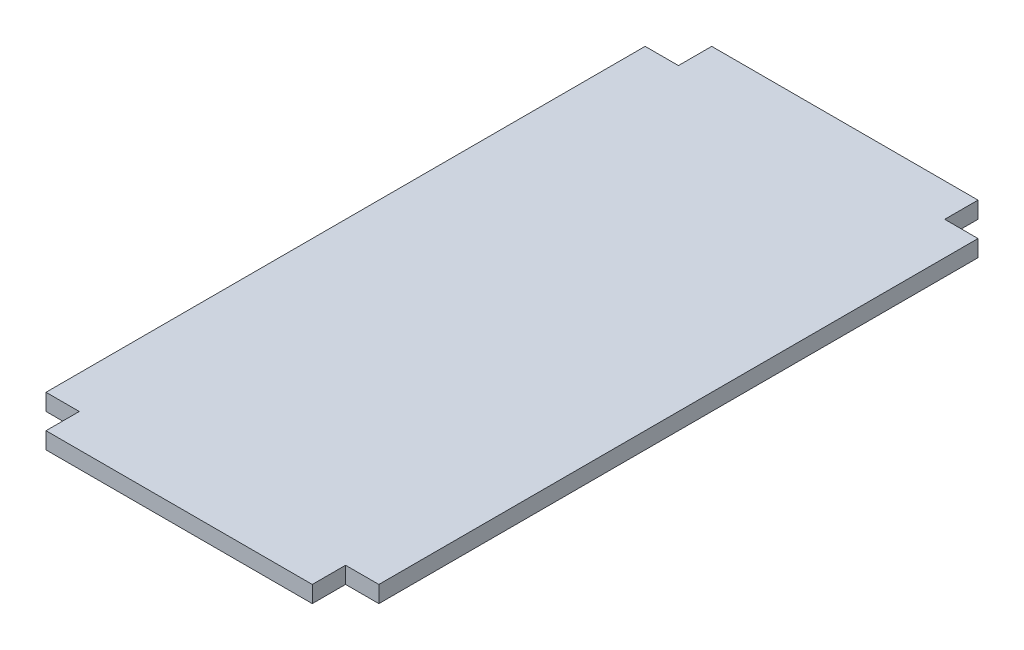
ISO-10303-21;
HEADER;
FILE_DESCRIPTION(('STEP AP214'),'2;1');
FILE_NAME('part.step','',(''),(''),'','','');
FILE_SCHEMA(('AUTOMOTIVE_DESIGN { 1 0 10303 214 1 1 1 1 }'));
ENDSEC;
DATA;
#1=APPLICATION_CONTEXT('core data for automotive mechanical design processes');
#2=APPLICATION_PROTOCOL_DEFINITION('international standard','automotive_design',2000,#1);
#3=PRODUCT_CONTEXT('',#1,'mechanical');
#4=PRODUCT('Part','Part','',(#3));
#5=PRODUCT_RELATED_PRODUCT_CATEGORY('part','',(#4));
#6=PRODUCT_DEFINITION_FORMATION('','',#4);
#7=PRODUCT_DEFINITION_CONTEXT('part definition',#1,'design');
#8=PRODUCT_DEFINITION('design','',#6,#7);
#9=PRODUCT_DEFINITION_SHAPE('','',#8);
#10=(LENGTH_UNIT() NAMED_UNIT(*) SI_UNIT(.MILLI.,.METRE.));
#11=(NAMED_UNIT(*) PLANE_ANGLE_UNIT() SI_UNIT($,.RADIAN.));
#12=(NAMED_UNIT(*) SI_UNIT($,.STERADIAN.) SOLID_ANGLE_UNIT());
#13=UNCERTAINTY_MEASURE_WITH_UNIT(LENGTH_MEASURE(1.E-05),#10,'distance_accuracy_value','');
#14=(GEOMETRIC_REPRESENTATION_CONTEXT(3) GLOBAL_UNCERTAINTY_ASSIGNED_CONTEXT((#13)) GLOBAL_UNIT_ASSIGNED_CONTEXT((#10,
#11,#12)) REPRESENTATION_CONTEXT('',''));
#15=CARTESIAN_POINT('',(0.,0.,0.));
#16=DIRECTION('',(0.,0.,1.));
#17=DIRECTION('',(1.,0.,0.));
#18=AXIS2_PLACEMENT_3D('',#15,#16,#17);
#19=CARTESIAN_POINT('',(-156.65052398525,19.05,920.183896907979));
#20=DIRECTION('',(0.,0.,-1.));
#21=DIRECTION('',(-1.,0.,0.));
#22=AXIS2_PLACEMENT_3D('',#19,#20,#21);
#23=PLANE('',#22);
#24=DIRECTION('',(1.,0.,0.));
#25=VECTOR('',#24,1.);
#26=CARTESIAN_POINT('',(-156.65052398525,0.,920.183896907979));
#27=LINE('',#26,#25);
#28=CARTESIAN_POINT('',(-194.75052398525,0.,920.183896907979));
#29=VERTEX_POINT('',#28);
#30=CARTESIAN_POINT('',(-156.65052398525,0.,920.183896907979));
#31=VERTEX_POINT('',#30);
#32=EDGE_CURVE('E186',#29,#31,#27,.T.);
#33=ORIENTED_EDGE('',*,*,#32,.T.);
#34=DIRECTION('',(0.,-1.,0.));
#35=VECTOR('',#34,1.);
#36=CARTESIAN_POINT('',(-156.65052398525,19.05,920.183896907979));
#37=LINE('',#36,#35);
#38=CARTESIAN_POINT('',(-156.65052398525,19.05,920.183896907979));
#39=VERTEX_POINT('',#38);
#40=EDGE_CURVE('E11',#39,#31,#37,.T.);
#41=ORIENTED_EDGE('',*,*,#40,.F.);
#42=DIRECTION('',(1.,0.,0.));
#43=VECTOR('',#42,1.);
#44=CARTESIAN_POINT('',(-156.65052398525,19.05,920.183896907979));
#45=LINE('',#44,#43);
#46=CARTESIAN_POINT('',(-194.75052398525,19.05,920.183896907979));
#47=VERTEX_POINT('',#46);
#48=EDGE_CURVE('E219',#47,#39,#45,.T.);
#49=ORIENTED_EDGE('',*,*,#48,.F.);
#50=DIRECTION('',(0.,-1.,0.));
#51=VECTOR('',#50,1.);
#52=CARTESIAN_POINT('',(-194.75052398525,19.05,920.183896907979));
#53=LINE('',#52,#51);
#54=EDGE_CURVE('E182',#47,#29,#53,.T.);
#55=ORIENTED_EDGE('',*,*,#54,.T.);
#56=EDGE_LOOP('',(#33,#41,#49,#55));
#57=FACE_BOUND('',#56,.T.);
#58=ADVANCED_FACE('F40',(#57),#23,.F.);
#59=CARTESIAN_POINT('',(-156.65052398525,19.05,958.283896907979));
#60=DIRECTION('',(1.,0.,0.));
#61=DIRECTION('',(0.,0.,-1.));
#62=AXIS2_PLACEMENT_3D('',#59,#60,#61);
#63=PLANE('',#62);
#64=DIRECTION('',(0.,0.,1.));
#65=VECTOR('',#64,1.);
#66=CARTESIAN_POINT('',(-156.65052398525,0.,958.283896907979));
#67=LINE('',#66,#65);
#68=CARTESIAN_POINT('',(-156.65052398525,0.,958.283896907979));
#69=VERTEX_POINT('',#68);
#70=EDGE_CURVE('E190',#31,#69,#67,.T.);
#71=ORIENTED_EDGE('',*,*,#70,.T.);
#72=DIRECTION('',(0.,-1.,0.));
#73=VECTOR('',#72,1.);
#74=CARTESIAN_POINT('',(-156.65052398525,19.05,958.283896907979));
#75=LINE('',#74,#73);
#76=CARTESIAN_POINT('',(-156.65052398525,19.05,958.283896907979));
#77=VERTEX_POINT('',#76);
#78=EDGE_CURVE('E49',#77,#69,#75,.T.);
#79=ORIENTED_EDGE('',*,*,#78,.F.);
#80=DIRECTION('',(0.,0.,1.));
#81=VECTOR('',#80,1.);
#82=CARTESIAN_POINT('',(-156.65052398525,19.05,958.283896907979));
#83=LINE('',#82,#81);
#84=EDGE_CURVE('E126',#39,#77,#83,.T.);
#85=ORIENTED_EDGE('',*,*,#84,.F.);
#86=ORIENTED_EDGE('',*,*,#40,.T.);
#87=EDGE_LOOP('',(#71,#79,#85,#86));
#88=FACE_BOUND('',#87,.T.);
#89=ADVANCED_FACE('F296',(#88),#63,.F.);
#90=CARTESIAN_POINT('',(148.14947601475,19.05,958.283896907979));
#91=DIRECTION('',(0.,0.,-1.));
#92=DIRECTION('',(-1.,0.,0.));
#93=AXIS2_PLACEMENT_3D('',#90,#91,#92);
#94=PLANE('',#93);
#95=DIRECTION('',(1.,0.,0.));
#96=VECTOR('',#95,1.);
#97=CARTESIAN_POINT('',(148.14947601475,0.,958.283896907979));
#98=LINE('',#97,#96);
#99=CARTESIAN_POINT('',(148.14947601475,0.,958.283896907979));
#100=VERTEX_POINT('',#99);
#101=EDGE_CURVE('E193',#69,#100,#98,.T.);
#102=ORIENTED_EDGE('',*,*,#101,.T.);
#103=DIRECTION('',(0.,-1.,0.));
#104=VECTOR('',#103,1.);
#105=CARTESIAN_POINT('',(148.14947601475,19.05,958.283896907979));
#106=LINE('',#105,#104);
#107=CARTESIAN_POINT('',(148.14947601475,19.05,958.283896907979));
#108=VERTEX_POINT('',#107);
#109=EDGE_CURVE('E246',#108,#100,#106,.T.);
#110=ORIENTED_EDGE('',*,*,#109,.F.);
#111=DIRECTION('',(1.,0.,0.));
#112=VECTOR('',#111,1.);
#113=CARTESIAN_POINT('',(148.14947601475,19.05,958.283896907979));
#114=LINE('',#113,#112);
#115=EDGE_CURVE('E258',#77,#108,#114,.T.);
#116=ORIENTED_EDGE('',*,*,#115,.F.);
#117=ORIENTED_EDGE('',*,*,#78,.T.);
#118=EDGE_LOOP('',(#102,#110,#116,#117));
#119=FACE_BOUND('',#118,.T.);
#120=ADVANCED_FACE('F256',(#119),#94,.F.);
#121=CARTESIAN_POINT('',(148.14947601475,19.05,920.183896907979));
#122=DIRECTION('',(-1.,0.,0.));
#123=DIRECTION('',(0.,0.,1.));
#124=AXIS2_PLACEMENT_3D('',#121,#122,#123);
#125=PLANE('',#124);
#126=DIRECTION('',(0.,0.,-1.));
#127=VECTOR('',#126,1.);
#128=CARTESIAN_POINT('',(148.14947601475,0.,920.183896907979));
#129=LINE('',#128,#127);
#130=CARTESIAN_POINT('',(148.14947601475,0.,920.183896907979));
#131=VERTEX_POINT('',#130);
#132=EDGE_CURVE('E196',#100,#131,#129,.T.);
#133=ORIENTED_EDGE('',*,*,#132,.T.);
#134=DIRECTION('',(0.,-1.,0.));
#135=VECTOR('',#134,1.);
#136=CARTESIAN_POINT('',(148.14947601475,19.05,920.183896907979));
#137=LINE('',#136,#135);
#138=CARTESIAN_POINT('',(148.14947601475,19.05,920.183896907979));
#139=VERTEX_POINT('',#138);
#140=EDGE_CURVE('E242',#139,#131,#137,.T.);
#141=ORIENTED_EDGE('',*,*,#140,.F.);
#142=DIRECTION('',(0.,0.,-1.));
#143=VECTOR('',#142,1.);
#144=CARTESIAN_POINT('',(148.14947601475,19.05,920.183896907979));
#145=LINE('',#144,#143);
#146=EDGE_CURVE('E277',#108,#139,#145,.T.);
#147=ORIENTED_EDGE('',*,*,#146,.F.);
#148=ORIENTED_EDGE('',*,*,#109,.T.);
#149=EDGE_LOOP('',(#133,#141,#147,#148));
#150=FACE_BOUND('',#149,.T.);
#151=ADVANCED_FACE('F267',(#150),#125,.F.);
#152=CARTESIAN_POINT('',(186.24947601475,19.05,920.183896907979));
#153=DIRECTION('',(0.,0.,-1.));
#154=DIRECTION('',(-1.,0.,0.));
#155=AXIS2_PLACEMENT_3D('',#152,#153,#154);
#156=PLANE('',#155);
#157=DIRECTION('',(1.,0.,0.));
#158=VECTOR('',#157,1.);
#159=CARTESIAN_POINT('',(186.24947601475,0.,920.183896907979));
#160=LINE('',#159,#158);
#161=CARTESIAN_POINT('',(186.24947601475,0.,920.183896907979));
#162=VERTEX_POINT('',#161);
#163=EDGE_CURVE('E199',#131,#162,#160,.T.);
#164=ORIENTED_EDGE('',*,*,#163,.T.);
#165=DIRECTION('',(0.,-1.,0.));
#166=VECTOR('',#165,1.);
#167=CARTESIAN_POINT('',(186.24947601475,19.05,920.183896907979));
#168=LINE('',#167,#166);
#169=CARTESIAN_POINT('',(186.24947601475,19.05,920.183896907979));
#170=VERTEX_POINT('',#169);
#171=EDGE_CURVE('E238',#170,#162,#168,.T.);
#172=ORIENTED_EDGE('',*,*,#171,.F.);
#173=DIRECTION('',(1.,0.,0.));
#174=VECTOR('',#173,1.);
#175=CARTESIAN_POINT('',(186.24947601475,19.05,920.183896907979));
#176=LINE('',#175,#174);
#177=EDGE_CURVE('E273',#139,#170,#176,.T.);
#178=ORIENTED_EDGE('',*,*,#177,.F.);
#179=ORIENTED_EDGE('',*,*,#140,.T.);
#180=EDGE_LOOP('',(#164,#172,#178,#179));
#181=FACE_BOUND('',#180,.T.);
#182=ADVANCED_FACE('F271',(#181),#156,.F.);
#183=CARTESIAN_POINT('',(186.24947601475,19.05,234.383896907979));
#184=DIRECTION('',(-1.,0.,0.));
#185=DIRECTION('',(0.,0.,1.));
#186=AXIS2_PLACEMENT_3D('',#183,#184,#185);
#187=PLANE('',#186);
#188=DIRECTION('',(0.,0.,-1.));
#189=VECTOR('',#188,1.);
#190=CARTESIAN_POINT('',(186.24947601475,0.,234.383896907979));
#191=LINE('',#190,#189);
#192=CARTESIAN_POINT('',(186.24947601475,0.,234.383896907979));
#193=VERTEX_POINT('',#192);
#194=EDGE_CURVE('E201',#162,#193,#191,.T.);
#195=ORIENTED_EDGE('',*,*,#194,.T.);
#196=DIRECTION('',(0.,-1.,0.));
#197=VECTOR('',#196,1.);
#198=CARTESIAN_POINT('',(186.24947601475,19.05,234.383896907979));
#199=LINE('',#198,#197);
#200=CARTESIAN_POINT('',(186.24947601475,19.05,234.383896907979));
#201=VERTEX_POINT('',#200);
#202=EDGE_CURVE('E234',#201,#193,#199,.T.);
#203=ORIENTED_EDGE('',*,*,#202,.F.);
#204=DIRECTION('',(0.,0.,-1.));
#205=VECTOR('',#204,1.);
#206=CARTESIAN_POINT('',(186.24947601475,19.05,234.383896907979));
#207=LINE('',#206,#205);
#208=EDGE_CURVE('E276',#170,#201,#207,.T.);
#209=ORIENTED_EDGE('',*,*,#208,.F.);
#210=ORIENTED_EDGE('',*,*,#171,.T.);
#211=EDGE_LOOP('',(#195,#203,#209,#210));
#212=FACE_BOUND('',#211,.T.);
#213=ADVANCED_FACE('F308',(#212),#187,.F.);
#214=CARTESIAN_POINT('',(148.14947601475,19.05,234.383896907979));
#215=DIRECTION('',(0.,0.,1.));
#216=DIRECTION('',(1.,0.,0.));
#217=AXIS2_PLACEMENT_3D('',#214,#215,#216);
#218=PLANE('',#217);
#219=DIRECTION('',(-1.,0.,0.));
#220=VECTOR('',#219,1.);
#221=CARTESIAN_POINT('',(148.14947601475,0.,234.383896907979));
#222=LINE('',#221,#220);
#223=CARTESIAN_POINT('',(148.14947601475,0.,234.383896907979));
#224=VERTEX_POINT('',#223);
#225=EDGE_CURVE('E204',#193,#224,#222,.T.);
#226=ORIENTED_EDGE('',*,*,#225,.T.);
#227=DIRECTION('',(0.,-1.,0.));
#228=VECTOR('',#227,1.);
#229=CARTESIAN_POINT('',(148.14947601475,19.05,234.383896907979));
#230=LINE('',#229,#228);
#231=CARTESIAN_POINT('',(148.14947601475,19.05,234.383896907979));
#232=VERTEX_POINT('',#231);
#233=EDGE_CURVE('E230',#232,#224,#230,.T.);
#234=ORIENTED_EDGE('',*,*,#233,.F.);
#235=DIRECTION('',(-1.,0.,0.));
#236=VECTOR('',#235,1.);
#237=CARTESIAN_POINT('',(148.14947601475,19.05,234.383896907979));
#238=LINE('',#237,#236);
#239=EDGE_CURVE('E280',#201,#232,#238,.T.);
#240=ORIENTED_EDGE('',*,*,#239,.F.);
#241=ORIENTED_EDGE('',*,*,#202,.T.);
#242=EDGE_LOOP('',(#226,#234,#240,#241));
#243=FACE_BOUND('',#242,.T.);
#244=ADVANCED_FACE('F311',(#243),#218,.F.);
#245=CARTESIAN_POINT('',(148.14947601475,19.05,196.283896907979));
#246=DIRECTION('',(-1.,0.,0.));
#247=DIRECTION('',(0.,0.,1.));
#248=AXIS2_PLACEMENT_3D('',#245,#246,#247);
#249=PLANE('',#248);
#250=DIRECTION('',(0.,0.,-1.));
#251=VECTOR('',#250,1.);
#252=CARTESIAN_POINT('',(148.14947601475,0.,196.283896907979));
#253=LINE('',#252,#251);
#254=CARTESIAN_POINT('',(148.14947601475,0.,196.283896907979));
#255=VERTEX_POINT('',#254);
#256=EDGE_CURVE('E207',#224,#255,#253,.T.);
#257=ORIENTED_EDGE('',*,*,#256,.T.);
#258=DIRECTION('',(0.,-1.,0.));
#259=VECTOR('',#258,1.);
#260=CARTESIAN_POINT('',(148.14947601475,19.05,196.283896907979));
#261=LINE('',#260,#259);
#262=CARTESIAN_POINT('',(148.14947601475,19.05,196.283896907979));
#263=VERTEX_POINT('',#262);
#264=EDGE_CURVE('E226',#263,#255,#261,.T.);
#265=ORIENTED_EDGE('',*,*,#264,.F.);
#266=DIRECTION('',(0.,0.,-1.));
#267=VECTOR('',#266,1.);
#268=CARTESIAN_POINT('',(148.14947601475,19.05,196.283896907979));
#269=LINE('',#268,#267);
#270=EDGE_CURVE('E287',#232,#263,#269,.T.);
#271=ORIENTED_EDGE('',*,*,#270,.F.);
#272=ORIENTED_EDGE('',*,*,#233,.T.);
#273=EDGE_LOOP('',(#257,#265,#271,#272));
#274=FACE_BOUND('',#273,.T.);
#275=ADVANCED_FACE('F315',(#274),#249,.F.);
#276=CARTESIAN_POINT('',(-156.65052398525,19.05,196.283896907979));
#277=DIRECTION('',(0.,0.,1.));
#278=DIRECTION('',(1.,0.,0.));
#279=AXIS2_PLACEMENT_3D('',#276,#277,#278);
#280=PLANE('',#279);
#281=DIRECTION('',(-1.,0.,0.));
#282=VECTOR('',#281,1.);
#283=CARTESIAN_POINT('',(-156.65052398525,0.,196.283896907979));
#284=LINE('',#283,#282);
#285=CARTESIAN_POINT('',(-156.65052398525,0.,196.283896907979));
#286=VERTEX_POINT('',#285);
#287=EDGE_CURVE('E210',#255,#286,#284,.T.);
#288=ORIENTED_EDGE('',*,*,#287,.T.);
#289=DIRECTION('',(0.,-1.,0.));
#290=VECTOR('',#289,1.);
#291=CARTESIAN_POINT('',(-156.65052398525,19.05,196.283896907979));
#292=LINE('',#291,#290);
#293=CARTESIAN_POINT('',(-156.65052398525,19.05,196.283896907979));
#294=VERTEX_POINT('',#293);
#295=EDGE_CURVE('E174',#294,#286,#292,.T.);
#296=ORIENTED_EDGE('',*,*,#295,.F.);
#297=DIRECTION('',(-1.,0.,0.));
#298=VECTOR('',#297,1.);
#299=CARTESIAN_POINT('',(-156.65052398525,19.05,196.283896907979));
#300=LINE('',#299,#298);
#301=EDGE_CURVE('E163',#263,#294,#300,.T.);
#302=ORIENTED_EDGE('',*,*,#301,.F.);
#303=ORIENTED_EDGE('',*,*,#264,.T.);
#304=EDGE_LOOP('',(#288,#296,#302,#303));
#305=FACE_BOUND('',#304,.T.);
#306=ADVANCED_FACE('F319',(#305),#280,.F.);
#307=CARTESIAN_POINT('',(-156.65052398525,19.05,234.383896907979));
#308=DIRECTION('',(1.,0.,0.));
#309=DIRECTION('',(0.,0.,-1.));
#310=AXIS2_PLACEMENT_3D('',#307,#308,#309);
#311=PLANE('',#310);
#312=DIRECTION('',(0.,0.,1.));
#313=VECTOR('',#312,1.);
#314=CARTESIAN_POINT('',(-156.65052398525,0.,234.383896907979));
#315=LINE('',#314,#313);
#316=CARTESIAN_POINT('',(-156.65052398525,0.,234.383896907979));
#317=VERTEX_POINT('',#316);
#318=EDGE_CURVE('E172',#286,#317,#315,.T.);
#319=ORIENTED_EDGE('',*,*,#318,.T.);
#320=DIRECTION('',(0.,-1.,0.));
#321=VECTOR('',#320,1.);
#322=CARTESIAN_POINT('',(-156.65052398525,19.05,234.383896907979));
#323=LINE('',#322,#321);
#324=CARTESIAN_POINT('',(-156.65052398525,19.05,234.383896907979));
#325=VERTEX_POINT('',#324);
#326=EDGE_CURVE('E169',#325,#317,#323,.T.);
#327=ORIENTED_EDGE('',*,*,#326,.F.);
#328=DIRECTION('',(0.,0.,1.));
#329=VECTOR('',#328,1.);
#330=CARTESIAN_POINT('',(-156.65052398525,19.05,234.383896907979));
#331=LINE('',#330,#329);
#332=EDGE_CURVE('E157',#294,#325,#331,.T.);
#333=ORIENTED_EDGE('',*,*,#332,.F.);
#334=ORIENTED_EDGE('',*,*,#295,.T.);
#335=EDGE_LOOP('',(#319,#327,#333,#334));
#336=FACE_BOUND('',#335,.T.);
#337=ADVANCED_FACE('F170',(#336),#311,.F.);
#338=CARTESIAN_POINT('',(-194.75052398525,19.05,234.383896907979));
#339=DIRECTION('',(0.,0.,1.));
#340=DIRECTION('',(1.,0.,0.));
#341=AXIS2_PLACEMENT_3D('',#338,#339,#340);
#342=PLANE('',#341);
#343=DIRECTION('',(-1.,0.,0.));
#344=VECTOR('',#343,1.);
#345=CARTESIAN_POINT('',(-194.75052398525,0.,234.383896907979));
#346=LINE('',#345,#344);
#347=CARTESIAN_POINT('',(-194.75052398525,0.,234.383896907979));
#348=VERTEX_POINT('',#347);
#349=EDGE_CURVE('E110',#317,#348,#346,.T.);
#350=ORIENTED_EDGE('',*,*,#349,.T.);
#351=DIRECTION('',(0.,-1.,0.));
#352=VECTOR('',#351,1.);
#353=CARTESIAN_POINT('',(-194.75052398525,19.05,234.383896907979));
#354=LINE('',#353,#352);
#355=CARTESIAN_POINT('',(-194.75052398525,19.05,234.383896907979));
#356=VERTEX_POINT('',#355);
#357=EDGE_CURVE('E175',#356,#348,#354,.T.);
#358=ORIENTED_EDGE('',*,*,#357,.F.);
#359=DIRECTION('',(-1.,0.,0.));
#360=VECTOR('',#359,1.);
#361=CARTESIAN_POINT('',(-194.75052398525,19.05,234.383896907979));
#362=LINE('',#361,#360);
#363=EDGE_CURVE('E161',#325,#356,#362,.T.);
#364=ORIENTED_EDGE('',*,*,#363,.F.);
#365=ORIENTED_EDGE('',*,*,#326,.T.);
#366=EDGE_LOOP('',(#350,#358,#364,#365));
#367=FACE_BOUND('',#366,.T.);
#368=ADVANCED_FACE('F177',(#367),#342,.F.);
#369=CARTESIAN_POINT('',(-194.75052398525,19.05,920.183896907979));
#370=DIRECTION('',(1.,0.,0.));
#371=DIRECTION('',(0.,0.,-1.));
#372=AXIS2_PLACEMENT_3D('',#369,#370,#371);
#373=PLANE('',#372);
#374=DIRECTION('',(0.,0.,1.));
#375=VECTOR('',#374,1.);
#376=CARTESIAN_POINT('',(-194.75052398525,0.,920.183896907979));
#377=LINE('',#376,#375);
#378=EDGE_CURVE('E116',#348,#29,#377,.T.);
#379=ORIENTED_EDGE('',*,*,#378,.T.);
#380=ORIENTED_EDGE('',*,*,#54,.F.);
#381=DIRECTION('',(0.,0.,1.));
#382=VECTOR('',#381,1.);
#383=CARTESIAN_POINT('',(-194.75052398525,19.05,920.183896907979));
#384=LINE('',#383,#382);
#385=EDGE_CURVE('E60',#356,#47,#384,.T.);
#386=ORIENTED_EDGE('',*,*,#385,.F.);
#387=ORIENTED_EDGE('',*,*,#357,.T.);
#388=EDGE_LOOP('',(#379,#380,#386,#387));
#389=FACE_BOUND('',#388,.T.);
#390=ADVANCED_FACE('F328',(#389),#373,.F.);
#391=CARTESIAN_POINT('',(0.,19.05,0.));
#392=DIRECTION('',(0.,-1.,0.));
#393=DIRECTION('',(0.,0.,-1.));
#394=AXIS2_PLACEMENT_3D('',#391,#392,#393);
#395=PLANE('',#394);
#396=ORIENTED_EDGE('',*,*,#48,.T.);
#397=ORIENTED_EDGE('',*,*,#84,.T.);
#398=ORIENTED_EDGE('',*,*,#115,.T.);
#399=ORIENTED_EDGE('',*,*,#146,.T.);
#400=ORIENTED_EDGE('',*,*,#177,.T.);
#401=ORIENTED_EDGE('',*,*,#208,.T.);
#402=ORIENTED_EDGE('',*,*,#239,.T.);
#403=ORIENTED_EDGE('',*,*,#270,.T.);
#404=ORIENTED_EDGE('',*,*,#301,.T.);
#405=ORIENTED_EDGE('',*,*,#332,.T.);
#406=ORIENTED_EDGE('',*,*,#363,.T.);
#407=ORIENTED_EDGE('',*,*,#385,.T.);
#408=EDGE_LOOP('',(#396,#397,#398,#399,#400,#401,#402,#403,#404,#405,#406,#407));
#409=FACE_BOUND('',#408,.T.);
#410=ADVANCED_FACE('F159',(#409),#395,.F.);
#411=CARTESIAN_POINT('',(0.,0.,0.));
#412=DIRECTION('',(0.,-1.,0.));
#413=DIRECTION('',(0.,0.,-1.));
#414=AXIS2_PLACEMENT_3D('',#411,#412,#413);
#415=PLANE('',#414);
#416=ORIENTED_EDGE('',*,*,#32,.F.);
#417=ORIENTED_EDGE('',*,*,#378,.F.);
#418=ORIENTED_EDGE('',*,*,#349,.F.);
#419=ORIENTED_EDGE('',*,*,#318,.F.);
#420=ORIENTED_EDGE('',*,*,#287,.F.);
#421=ORIENTED_EDGE('',*,*,#256,.F.);
#422=ORIENTED_EDGE('',*,*,#225,.F.);
#423=ORIENTED_EDGE('',*,*,#194,.F.);
#424=ORIENTED_EDGE('',*,*,#163,.F.);
#425=ORIENTED_EDGE('',*,*,#132,.F.);
#426=ORIENTED_EDGE('',*,*,#101,.F.);
#427=ORIENTED_EDGE('',*,*,#70,.F.);
#428=EDGE_LOOP('',(#416,#417,#418,#419,#420,#421,#422,#423,#424,#425,#426,#427));
#429=FACE_BOUND('',#428,.T.);
#430=ADVANCED_FACE('F262',(#429),#415,.T.);
#431=CLOSED_SHELL('',(#58,#89,#120,#151,#182,#213,#244,#275,#306,#337,#368,#390,#410,#430));
#432=MANIFOLD_SOLID_BREP('B2',#431);
#433=ADVANCED_BREP_SHAPE_REPRESENTATION('',(#18,#432),#14);
#434=SHAPE_DEFINITION_REPRESENTATION(#9,#433);
ENDSEC;
END-ISO-10303-21;
